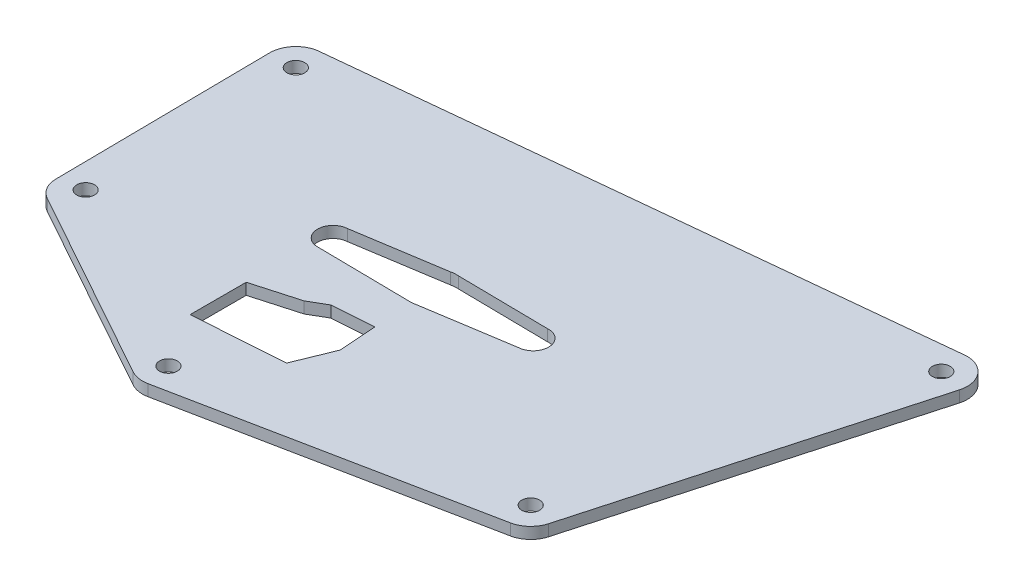
ISO-10303-21;
HEADER;
FILE_DESCRIPTION(('STEP AP214'),'2;1');
FILE_NAME('part.step','',(''),(''),'','','');
FILE_SCHEMA(('AUTOMOTIVE_DESIGN { 1 0 10303 214 1 1 1 1 }'));
ENDSEC;
DATA;
#1=APPLICATION_CONTEXT('core data for automotive mechanical design processes');
#2=APPLICATION_PROTOCOL_DEFINITION('international standard','automotive_design',2000,#1);
#3=PRODUCT_CONTEXT('',#1,'mechanical');
#4=PRODUCT('Part','Part','',(#3));
#5=PRODUCT_RELATED_PRODUCT_CATEGORY('part','',(#4));
#6=PRODUCT_DEFINITION_FORMATION('','',#4);
#7=PRODUCT_DEFINITION_CONTEXT('part definition',#1,'design');
#8=PRODUCT_DEFINITION('design','',#6,#7);
#9=PRODUCT_DEFINITION_SHAPE('','',#8);
#10=(LENGTH_UNIT() NAMED_UNIT(*) SI_UNIT(.MILLI.,.METRE.));
#11=(NAMED_UNIT(*) PLANE_ANGLE_UNIT() SI_UNIT($,.RADIAN.));
#12=(NAMED_UNIT(*) SI_UNIT($,.STERADIAN.) SOLID_ANGLE_UNIT());
#13=UNCERTAINTY_MEASURE_WITH_UNIT(LENGTH_MEASURE(1.E-05),#10,'distance_accuracy_value','');
#14=(GEOMETRIC_REPRESENTATION_CONTEXT(3) GLOBAL_UNCERTAINTY_ASSIGNED_CONTEXT((#13)) GLOBAL_UNIT_ASSIGNED_CONTEXT((#10,
#11,#12)) REPRESENTATION_CONTEXT('',''));
#15=CARTESIAN_POINT('',(0.,0.,0.));
#16=DIRECTION('',(0.,0.,1.));
#17=DIRECTION('',(1.,0.,0.));
#18=AXIS2_PLACEMENT_3D('',#15,#16,#17);
#19=CARTESIAN_POINT('',(-3.55000562107084,3.175,1.59698455984096));
#20=DIRECTION('',(0.,1.,0.));
#21=DIRECTION('',(0.,0.,1.));
#22=AXIS2_PLACEMENT_3D('',#19,#20,#21);
#23=PLANE('',#22);
#24=CARTESIAN_POINT('',(68.783132472174,3.175,-24.6864030686346));
#25=DIRECTION('',(0.,1.,0.));
#26=DIRECTION('',(0.,0.,1.));
#27=AXIS2_PLACEMENT_3D('',#24,#25,#26);
#28=CIRCLE('',#27,6.5405);
#29=CARTESIAN_POINT('',(69.4259490579315,3.175,-31.1952376100157));
#30=VERTEX_POINT('',#29);
#31=CARTESIAN_POINT('',(67.2249412442559,3.175,-31.0385822496117));
#32=VERTEX_POINT('',#31);
#33=EDGE_CURVE('E63',#30,#32,#28,.T.);
#34=ORIENTED_EDGE('',*,*,#33,.F.);
#35=DIRECTION('',(-0.999906246555034,0.,-0.0136929945674083));
#36=VECTOR('',#35,1.);
#37=CARTESIAN_POINT('',(69.4259490579315,3.175,-31.1952376100157));
#38=LINE('',#37,#36);
#39=CARTESIAN_POINT('',(94.5725620865182,3.175,-30.8508728890476));
#40=VERTEX_POINT('',#39);
#41=EDGE_CURVE('E237',#40,#30,#38,.T.);
#42=ORIENTED_EDGE('',*,*,#41,.F.);
#43=CARTESIAN_POINT('',(94.8791175551361,3.175,-26.5437685549665));
#44=DIRECTION('',(0.,1.,0.));
#45=DIRECTION('',(0.,0.,1.));
#46=AXIS2_PLACEMENT_3D('',#43,#44,#45);
#47=CIRCLE('',#46,4.318);
#48=CARTESIAN_POINT('',(95.185673023754,3.175,-22.2366642208853));
#49=VERTEX_POINT('',#48);
#50=EDGE_CURVE('E241',#49,#40,#47,.T.);
#51=ORIENTED_EDGE('',*,*,#50,.F.);
#52=DIRECTION('',(0.987887317154174,0.,-0.155172963514683));
#53=VECTOR('',#52,1.);
#54=CARTESIAN_POINT('',(70.3413237000924,3.175,-18.3342238876576));
#55=LINE('',#54,#53);
#56=CARTESIAN_POINT('',(70.3413237000924,3.175,-18.3342238876576));
#57=VERTEX_POINT('',#56);
#58=EDGE_CURVE('E280',#57,#49,#55,.T.);
#59=ORIENTED_EDGE('',*,*,#58,.F.);
#60=CARTESIAN_POINT('',(68.783132472174,3.175,-24.6864030686346));
#61=DIRECTION('',(0.,1.,0.));
#62=DIRECTION('',(0.,0.,1.));
#63=AXIS2_PLACEMENT_3D('',#60,#61,#62);
#64=CIRCLE('',#63,6.5405);
#65=CARTESIAN_POINT('',(68.1403158864175,3.175,-18.1775685272535));
#66=VERTEX_POINT('',#65);
#67=EDGE_CURVE('E276',#66,#57,#64,.T.);
#68=ORIENTED_EDGE('',*,*,#67,.F.);
#69=DIRECTION('',(0.999906246555034,0.,0.0136929945674115));
#70=VECTOR('',#69,1.);
#71=CARTESIAN_POINT('',(42.9937028578297,3.175,-18.5219332482216));
#72=LINE('',#71,#70);
#73=CARTESIAN_POINT('',(42.9937028578297,3.175,-18.5219332482216));
#74=VERTEX_POINT('',#73);
#75=EDGE_CURVE('E272',#74,#66,#72,.T.);
#76=ORIENTED_EDGE('',*,*,#75,.F.);
#77=CARTESIAN_POINT('',(42.6871473892118,3.175,-22.8290375823028));
#78=DIRECTION('',(0.,1.,0.));
#79=DIRECTION('',(0.,0.,1.));
#80=AXIS2_PLACEMENT_3D('',#77,#78,#79);
#81=CIRCLE('',#80,4.31800000000001);
#82=CARTESIAN_POINT('',(42.380591920594,3.175,-27.1361419163839));
#83=VERTEX_POINT('',#82);
#84=EDGE_CURVE('E268',#83,#74,#81,.T.);
#85=ORIENTED_EDGE('',*,*,#84,.F.);
#86=DIRECTION('',(-0.987887317154174,0.,0.155172963514684));
#87=VECTOR('',#86,1.);
#88=CARTESIAN_POINT('',(42.380591920594,3.175,-27.1361419163839));
#89=LINE('',#88,#87);
#90=EDGE_CURVE('E265',#32,#83,#89,.T.);
#91=ORIENTED_EDGE('',*,*,#90,.F.);
#92=EDGE_LOOP('',(#34,#42,#51,#59,#68,#76,#85,#91));
#93=FACE_BOUND('',#92,.T.);
#94=DIRECTION('',(0.,0.,1.));
#95=VECTOR('',#94,1.);
#96=CARTESIAN_POINT('',(41.2559345364309,3.175,0.));
#97=LINE('',#96,#95);
#98=CARTESIAN_POINT('',(41.2559345364309,3.175,0.));
#99=VERTEX_POINT('',#98);
#100=CARTESIAN_POINT('',(41.2559345364309,3.175,15.6784413285765));
#101=VERTEX_POINT('',#100);
#102=EDGE_CURVE('E290',#99,#101,#97,.T.);
#103=ORIENTED_EDGE('',*,*,#102,.F.);
#104=DIRECTION('',(-0.961898419475829,0.,0.27340707856583));
#105=VECTOR('',#104,1.);
#106=CARTESIAN_POINT('',(53.8620195794234,3.175,-3.58311523750619));
#107=LINE('',#106,#105);
#108=CARTESIAN_POINT('',(53.8620195794234,3.175,-3.58311523750619));
#109=VERTEX_POINT('',#108);
#110=EDGE_CURVE('E313',#109,#99,#107,.T.);
#111=ORIENTED_EDGE('',*,*,#110,.F.);
#112=DIRECTION('',(-0.864923842799596,0.,0.501903124274775));
#113=VECTOR('',#112,1.);
#114=CARTESIAN_POINT('',(58.5654688802979,3.175,-6.31246062280146));
#115=LINE('',#114,#113);
#116=CARTESIAN_POINT('',(58.5654688802979,3.175,-6.31246062280146));
#117=VERTEX_POINT('',#116);
#118=EDGE_CURVE('E356',#117,#109,#115,.T.);
#119=ORIENTED_EDGE('',*,*,#118,.F.);
#120=DIRECTION('',(-0.997476686910869,0.,0.0709947819865392));
#121=VECTOR('',#120,1.);
#122=CARTESIAN_POINT('',(70.0327952928143,3.175,-7.12864043863893));
#123=LINE('',#122,#121);
#124=CARTESIAN_POINT('',(70.0327952928143,3.175,-7.12864043863893));
#125=VERTEX_POINT('',#124);
#126=EDGE_CURVE('E352',#125,#117,#123,.T.);
#127=ORIENTED_EDGE('',*,*,#126,.F.);
#128=DIRECTION('',(-0.0709947819865391,0.,-0.997476686910869));
#129=VECTOR('',#128,1.);
#130=CARTESIAN_POINT('',(70.7748098328332,3.175,3.29666384862661));
#131=LINE('',#130,#129);
#132=CARTESIAN_POINT('',(70.7748098328332,3.175,3.29666384862661));
#133=VERTEX_POINT('',#132);
#134=EDGE_CURVE('E348',#133,#125,#131,.T.);
#135=ORIENTED_EDGE('',*,*,#134,.F.);
#136=DIRECTION('',(0.376798129201933,0.,-0.926295400954751));
#137=VECTOR('',#136,1.);
#138=CARTESIAN_POINT('',(66.4681046224158,3.175,13.8839808242359));
#139=LINE('',#138,#137);
#140=CARTESIAN_POINT('',(66.4681046224158,3.175,13.8839808242359));
#141=VERTEX_POINT('',#140);
#142=EDGE_CURVE('E344',#141,#133,#139,.T.);
#143=ORIENTED_EDGE('',*,*,#142,.F.);
#144=DIRECTION('',(0.997476686910869,0.,-0.0709947819865385));
#145=VECTOR('',#144,1.);
#146=CARTESIAN_POINT('',(41.2559345364309,3.175,15.6784413285765));
#147=LINE('',#146,#145);
#148=EDGE_CURVE('E340',#101,#141,#147,.T.);
#149=ORIENTED_EDGE('',*,*,#148,.F.);
#150=EDGE_LOOP('',(#103,#111,#119,#127,#135,#143,#149));
#151=FACE_BOUND('',#150,.T.);
#152=CARTESIAN_POINT('',(-3.71964814280204,3.175,-58.83082926478));
#153=DIRECTION('',(0.,1.,0.));
#154=DIRECTION('',(0.,0.,1.));
#155=AXIS2_PLACEMENT_3D('',#152,#153,#154);
#156=CIRCLE('',#155,2.4892);
#157=CARTESIAN_POINT('',(-3.71964814280204,3.175,-56.34162926478));
#158=VERTEX_POINT('',#157);
#159=EDGE_CURVE('E393',#158,#158,#156,.T.);
#160=ORIENTED_EDGE('',*,*,#159,.F.);
#161=EDGE_LOOP('',(#160));
#162=FACE_BOUND('',#161,.T.);
#163=CARTESIAN_POINT('',(50.6688213969302,3.175,31.1332223314106));
#164=DIRECTION('',(0.,1.,0.));
#165=DIRECTION('',(0.,0.,1.));
#166=AXIS2_PLACEMENT_3D('',#163,#164,#165);
#167=CIRCLE('',#166,2.4892);
#168=CARTESIAN_POINT('',(50.6688213969302,3.175,33.6224223314105));
#169=VERTEX_POINT('',#168);
#170=EDGE_CURVE('E409',#169,#169,#167,.T.);
#171=ORIENTED_EDGE('',*,*,#170,.F.);
#172=EDGE_LOOP('',(#171));
#173=FACE_BOUND('',#172,.T.);
#174=CARTESIAN_POINT('',(-3.55000562107084,3.175,1.59698455984096));
#175=DIRECTION('',(0.,1.,0.));
#176=DIRECTION('',(0.,0.,1.));
#177=AXIS2_PLACEMENT_3D('',#174,#175,#176);
#178=CIRCLE('',#177,6.73934713952884);
#179=CARTESIAN_POINT('',(-10.2889241238706,3.175,1.67299297844045));
#180=VERTEX_POINT('',#179);
#181=CARTESIAN_POINT('',(-6.82298680015305,3.175,7.48819785325084));
#182=VERTEX_POINT('',#181);
#183=EDGE_CURVE('E425',#180,#182,#178,.T.);
#184=ORIENTED_EDGE('',*,*,#183,.T.);
#185=DIRECTION('',(0.874151927692767,0.,0.485652558225547));
#186=VECTOR('',#185,1.);
#187=CARTESIAN_POINT('',(-6.82298680015305,3.175,7.48819785325084));
#188=LINE('',#187,#186);
#189=CARTESIAN_POINT('',(47.147014740446,3.175,37.4723098654602));
#190=VERTEX_POINT('',#189);
#191=EDGE_CURVE('E429',#182,#190,#188,.T.);
#192=ORIENTED_EDGE('',*,*,#191,.T.);
#193=CARTESIAN_POINT('',(50.6688213969302,3.175,31.1332223314106));
#194=DIRECTION('',(0.,1.,0.));
#195=DIRECTION('',(0.,0.,1.));
#196=AXIS2_PLACEMENT_3D('',#193,#194,#195);
#197=CIRCLE('',#196,7.2517);
#198=CARTESIAN_POINT('',(52.0976679162457,3.175,38.2427617338079));
#199=VERTEX_POINT('',#198);
#200=EDGE_CURVE('E433',#190,#199,#197,.T.);
#201=ORIENTED_EDGE('',*,*,#200,.T.);
#202=DIRECTION('',(0.980396238454062,0.,-0.197036076963399));
#203=VECTOR('',#202,1.);
#204=CARTESIAN_POINT('',(52.0976679162457,3.175,38.2427617338079));
#205=LINE('',#204,#203);
#206=CARTESIAN_POINT('',(136.359344262205,3.175,21.3081902877289));
#207=VERTEX_POINT('',#206);
#208=EDGE_CURVE('E436',#199,#207,#205,.T.);
#209=ORIENTED_EDGE('',*,*,#208,.T.);
#210=CARTESIAN_POINT('',(134.930497742889,3.175,14.1986508853315));
#211=DIRECTION('',(0.,1.,0.));
#212=DIRECTION('',(0.,0.,1.));
#213=AXIS2_PLACEMENT_3D('',#210,#211,#212);
#214=CIRCLE('',#213,7.25170000000002);
#215=CARTESIAN_POINT('',(141.916296900979,3.175,16.1443546173629));
#216=VERTEX_POINT('',#215);
#217=EDGE_CURVE('E439',#207,#216,#214,.T.);
#218=ORIENTED_EDGE('',*,*,#217,.T.);
#219=DIRECTION('',(0.268310014483694,0.,-0.96333261967389));
#220=VECTOR('',#219,1.);
#221=CARTESIAN_POINT('',(141.916296900979,3.175,16.1443546173629));
#222=LINE('',#221,#220);
#223=CARTESIAN_POINT('',(166.903433989707,3.175,-73.5687493685413));
#224=VERTEX_POINT('',#223);
#225=EDGE_CURVE('E442',#216,#224,#222,.T.);
#226=ORIENTED_EDGE('',*,*,#225,.T.);
#227=CARTESIAN_POINT('',(159.917634831618,3.175,-75.5144531005728));
#228=DIRECTION('',(0.,1.,0.));
#229=DIRECTION('',(0.,0.,1.));
#230=AXIS2_PLACEMENT_3D('',#227,#228,#229);
#231=CIRCLE('',#230,7.2517);
#232=CARTESIAN_POINT('',(159.182077211553,3.175,-82.728751949218));
#233=VERTEX_POINT('',#232);
#234=EDGE_CURVE('E445',#224,#233,#231,.T.);
#235=ORIENTED_EDGE('',*,*,#234,.T.);
#236=DIRECTION('',(-0.994842429864068,0.,0.101432439299058));
#237=VECTOR('',#236,1.);
#238=CARTESIAN_POINT('',(-4.36614572243492,3.175,-66.0536537655919));
#239=LINE('',#238,#237);
#240=CARTESIAN_POINT('',(-4.36614572243492,3.175,-66.0536537655919));
#241=VERTEX_POINT('',#240);
#242=EDGE_CURVE('E448',#233,#241,#239,.T.);
#243=ORIENTED_EDGE('',*,*,#242,.T.);
#244=CARTESIAN_POINT('',(-3.71964814280204,3.175,-58.83082926478));
#245=DIRECTION('',(0.,1.,0.));
#246=DIRECTION('',(0.,0.,1.));
#247=AXIS2_PLACEMENT_3D('',#244,#245,#246);
#248=CIRCLE('',#247,7.2517);
#249=CARTESIAN_POINT('',(-10.9695033076541,3.175,-58.6672658866423));
#250=VERTEX_POINT('',#249);
#251=EDGE_CURVE('E451',#241,#250,#248,.T.);
#252=ORIENTED_EDGE('',*,*,#251,.T.);
#253=DIRECTION('',(0.0112783058990494,0.,0.999936397885409));
#254=VECTOR('',#253,1.);
#255=CARTESIAN_POINT('',(-10.9695033076541,3.175,-58.6672658866423));
#256=LINE('',#255,#254);
#257=EDGE_CURVE('E454',#250,#180,#256,.T.);
#258=ORIENTED_EDGE('',*,*,#257,.T.);
#259=EDGE_LOOP('',(#184,#192,#201,#209,#218,#226,#235,#243,#252,#258));
#260=FACE_BOUND('',#259,.T.);
#261=CARTESIAN_POINT('',(159.917634831618,3.175,-75.5144531005728));
#262=DIRECTION('',(0.,1.,0.));
#263=DIRECTION('',(0.,0.,1.));
#264=AXIS2_PLACEMENT_3D('',#261,#262,#263);
#265=CIRCLE('',#264,2.48919999999963);
#266=CARTESIAN_POINT('',(159.917634831618,3.175,-73.0252531005731));
#267=VERTEX_POINT('',#266);
#268=EDGE_CURVE('E417',#267,#267,#265,.T.);
#269=ORIENTED_EDGE('',*,*,#268,.F.);
#270=EDGE_LOOP('',(#269));
#271=FACE_BOUND('',#270,.T.);
#272=CARTESIAN_POINT('',(134.930497742889,3.175,14.1986508853315));
#273=DIRECTION('',(0.,1.,0.));
#274=DIRECTION('',(0.,0.,1.));
#275=AXIS2_PLACEMENT_3D('',#272,#273,#274);
#276=CIRCLE('',#275,2.4892);
#277=CARTESIAN_POINT('',(134.930497742889,3.175,16.6878508853315));
#278=VERTEX_POINT('',#277);
#279=EDGE_CURVE('E401',#278,#278,#276,.T.);
#280=ORIENTED_EDGE('',*,*,#279,.F.);
#281=EDGE_LOOP('',(#280));
#282=FACE_BOUND('',#281,.T.);
#283=CARTESIAN_POINT('',(-3.50812631941597,3.175,0.0860171733952156));
#284=DIRECTION('',(0.,1.,0.));
#285=DIRECTION('',(0.,0.,1.));
#286=AXIS2_PLACEMENT_3D('',#283,#284,#285);
#287=CIRCLE('',#286,2.4892);
#288=CARTESIAN_POINT('',(-3.50812631941597,3.175,2.57521717339521));
#289=VERTEX_POINT('',#288);
#290=EDGE_CURVE('E385',#289,#289,#287,.T.);
#291=ORIENTED_EDGE('',*,*,#290,.F.);
#292=EDGE_LOOP('',(#291));
#293=FACE_BOUND('',#292,.T.);
#294=ADVANCED_FACE('F47',(#93,#151,#162,#173,#260,#271,#282,#293),#23,.T.);
#295=CARTESIAN_POINT('',(-3.55000562107084,0.,1.59698455984096));
#296=DIRECTION('',(0.,1.,0.));
#297=DIRECTION('',(0.,0.,1.));
#298=AXIS2_PLACEMENT_3D('',#295,#296,#297);
#299=PLANE('',#298);
#300=DIRECTION('',(-0.999906246555034,0.,-0.0136929945674083));
#301=VECTOR('',#300,1.);
#302=CARTESIAN_POINT('',(69.4259490579315,0.,-31.1952376100157));
#303=LINE('',#302,#301);
#304=CARTESIAN_POINT('',(94.5725620865182,0.,-30.8508728890476));
#305=VERTEX_POINT('',#304);
#306=CARTESIAN_POINT('',(69.4259490579315,0.,-31.1952376100157));
#307=VERTEX_POINT('',#306);
#308=EDGE_CURVE('E224',#305,#307,#303,.T.);
#309=ORIENTED_EDGE('',*,*,#308,.T.);
#310=CARTESIAN_POINT('',(68.783132472174,0.,-24.6864030686346));
#311=DIRECTION('',(0.,1.,0.));
#312=DIRECTION('',(0.,0.,1.));
#313=AXIS2_PLACEMENT_3D('',#310,#311,#312);
#314=CIRCLE('',#313,6.5405);
#315=CARTESIAN_POINT('',(67.2249412442559,0.,-31.0385822496117));
#316=VERTEX_POINT('',#315);
#317=EDGE_CURVE('E217',#307,#316,#314,.T.);
#318=ORIENTED_EDGE('',*,*,#317,.T.);
#319=DIRECTION('',(-0.987887317154174,0.,0.155172963514684));
#320=VECTOR('',#319,1.);
#321=CARTESIAN_POINT('',(42.380591920594,0.,-27.1361419163839));
#322=LINE('',#321,#320);
#323=CARTESIAN_POINT('',(42.380591920594,0.,-27.1361419163839));
#324=VERTEX_POINT('',#323);
#325=EDGE_CURVE('E227',#316,#324,#322,.T.);
#326=ORIENTED_EDGE('',*,*,#325,.T.);
#327=CARTESIAN_POINT('',(42.6871473892118,0.,-22.8290375823028));
#328=DIRECTION('',(0.,1.,0.));
#329=DIRECTION('',(0.,0.,1.));
#330=AXIS2_PLACEMENT_3D('',#327,#328,#329);
#331=CIRCLE('',#330,4.31800000000001);
#332=CARTESIAN_POINT('',(42.9937028578297,0.,-18.5219332482216));
#333=VERTEX_POINT('',#332);
#334=EDGE_CURVE('E71',#324,#333,#331,.T.);
#335=ORIENTED_EDGE('',*,*,#334,.T.);
#336=DIRECTION('',(0.999906246555034,0.,0.0136929945674115));
#337=VECTOR('',#336,1.);
#338=CARTESIAN_POINT('',(42.9937028578297,0.,-18.5219332482216));
#339=LINE('',#338,#337);
#340=CARTESIAN_POINT('',(68.1403158864175,0.,-18.1775685272535));
#341=VERTEX_POINT('',#340);
#342=EDGE_CURVE('E246',#333,#341,#339,.T.);
#343=ORIENTED_EDGE('',*,*,#342,.T.);
#344=CARTESIAN_POINT('',(68.783132472174,0.,-24.6864030686346));
#345=DIRECTION('',(0.,1.,0.));
#346=DIRECTION('',(0.,0.,1.));
#347=AXIS2_PLACEMENT_3D('',#344,#345,#346);
#348=CIRCLE('',#347,6.5405);
#349=CARTESIAN_POINT('',(70.3413237000924,0.,-18.3342238876576));
#350=VERTEX_POINT('',#349);
#351=EDGE_CURVE('E250',#341,#350,#348,.T.);
#352=ORIENTED_EDGE('',*,*,#351,.T.);
#353=DIRECTION('',(0.987887317154174,0.,-0.155172963514683));
#354=VECTOR('',#353,1.);
#355=CARTESIAN_POINT('',(70.3413237000924,0.,-18.3342238876576));
#356=LINE('',#355,#354);
#357=CARTESIAN_POINT('',(95.185673023754,0.,-22.2366642208853));
#358=VERTEX_POINT('',#357);
#359=EDGE_CURVE('E254',#350,#358,#356,.T.);
#360=ORIENTED_EDGE('',*,*,#359,.T.);
#361=CARTESIAN_POINT('',(94.8791175551361,0.,-26.5437685549665));
#362=DIRECTION('',(0.,1.,0.));
#363=DIRECTION('',(0.,0.,1.));
#364=AXIS2_PLACEMENT_3D('',#361,#362,#363);
#365=CIRCLE('',#364,4.318);
#366=EDGE_CURVE('E258',#358,#305,#365,.T.);
#367=ORIENTED_EDGE('',*,*,#366,.T.);
#368=EDGE_LOOP('',(#309,#318,#326,#335,#343,#352,#360,#367));
#369=FACE_BOUND('',#368,.T.);
#370=DIRECTION('',(-0.961898419475829,0.,0.27340707856583));
#371=VECTOR('',#370,1.);
#372=CARTESIAN_POINT('',(53.8620195794234,0.,-3.58311523750619));
#373=LINE('',#372,#371);
#374=CARTESIAN_POINT('',(53.8620195794234,0.,-3.58311523750619));
#375=VERTEX_POINT('',#374);
#376=CARTESIAN_POINT('',(41.2559345364309,0.,0.));
#377=VERTEX_POINT('',#376);
#378=EDGE_CURVE('E333',#375,#377,#373,.T.);
#379=ORIENTED_EDGE('',*,*,#378,.T.);
#380=DIRECTION('',(0.,0.,1.));
#381=VECTOR('',#380,1.);
#382=CARTESIAN_POINT('',(41.2559345364309,0.,0.));
#383=LINE('',#382,#381);
#384=CARTESIAN_POINT('',(41.2559345364309,0.,15.6784413285765));
#385=VERTEX_POINT('',#384);
#386=EDGE_CURVE('E308',#377,#385,#383,.T.);
#387=ORIENTED_EDGE('',*,*,#386,.T.);
#388=DIRECTION('',(0.997476686910869,0.,-0.0709947819865385));
#389=VECTOR('',#388,1.);
#390=CARTESIAN_POINT('',(41.2559345364309,0.,15.6784413285765));
#391=LINE('',#390,#389);
#392=CARTESIAN_POINT('',(66.4681046224158,0.,13.8839808242359));
#393=VERTEX_POINT('',#392);
#394=EDGE_CURVE('E312',#385,#393,#391,.T.);
#395=ORIENTED_EDGE('',*,*,#394,.T.);
#396=DIRECTION('',(0.376798129201933,0.,-0.926295400954751));
#397=VECTOR('',#396,1.);
#398=CARTESIAN_POINT('',(66.4681046224158,0.,13.8839808242359));
#399=LINE('',#398,#397);
#400=CARTESIAN_POINT('',(70.7748098328332,0.,3.29666384862661));
#401=VERTEX_POINT('',#400);
#402=EDGE_CURVE('E317',#393,#401,#399,.T.);
#403=ORIENTED_EDGE('',*,*,#402,.T.);
#404=DIRECTION('',(-0.0709947819865391,0.,-0.997476686910869));
#405=VECTOR('',#404,1.);
#406=CARTESIAN_POINT('',(70.7748098328332,0.,3.29666384862661));
#407=LINE('',#406,#405);
#408=CARTESIAN_POINT('',(70.0327952928143,0.,-7.12864043863893));
#409=VERTEX_POINT('',#408);
#410=EDGE_CURVE('E321',#401,#409,#407,.T.);
#411=ORIENTED_EDGE('',*,*,#410,.T.);
#412=DIRECTION('',(-0.997476686910869,0.,0.0709947819865392));
#413=VECTOR('',#412,1.);
#414=CARTESIAN_POINT('',(70.0327952928143,0.,-7.12864043863893));
#415=LINE('',#414,#413);
#416=CARTESIAN_POINT('',(58.5654688802979,0.,-6.31246062280146));
#417=VERTEX_POINT('',#416);
#418=EDGE_CURVE('E325',#409,#417,#415,.T.);
#419=ORIENTED_EDGE('',*,*,#418,.T.);
#420=DIRECTION('',(-0.864923842799596,0.,0.501903124274775));
#421=VECTOR('',#420,1.);
#422=CARTESIAN_POINT('',(58.5654688802979,0.,-6.31246062280146));
#423=LINE('',#422,#421);
#424=EDGE_CURVE('E329',#417,#375,#423,.T.);
#425=ORIENTED_EDGE('',*,*,#424,.T.);
#426=EDGE_LOOP('',(#379,#387,#395,#403,#411,#419,#425));
#427=FACE_BOUND('',#426,.T.);
#428=CARTESIAN_POINT('',(-3.55000562107084,0.,1.59698455984096));
#429=DIRECTION('',(0.,1.,0.));
#430=DIRECTION('',(0.,0.,1.));
#431=AXIS2_PLACEMENT_3D('',#428,#429,#430);
#432=CIRCLE('',#431,6.73934713952884);
#433=CARTESIAN_POINT('',(-10.2889241238706,0.,1.67299297844045));
#434=VERTEX_POINT('',#433);
#435=CARTESIAN_POINT('',(-6.82298680015305,0.,7.48819785325084));
#436=VERTEX_POINT('',#435);
#437=EDGE_CURVE('E421',#434,#436,#432,.T.);
#438=ORIENTED_EDGE('',*,*,#437,.F.);
#439=DIRECTION('',(0.0112783058990494,0.,0.999936397885409));
#440=VECTOR('',#439,1.);
#441=CARTESIAN_POINT('',(-10.9695033076541,0.,-58.6672658866423));
#442=LINE('',#441,#440);
#443=CARTESIAN_POINT('',(-10.9695033076541,0.,-58.6672658866423));
#444=VERTEX_POINT('',#443);
#445=EDGE_CURVE('E430',#444,#434,#442,.T.);
#446=ORIENTED_EDGE('',*,*,#445,.F.);
#447=CARTESIAN_POINT('',(-3.71964814280204,0.,-58.83082926478));
#448=DIRECTION('',(0.,1.,0.));
#449=DIRECTION('',(0.,0.,1.));
#450=AXIS2_PLACEMENT_3D('',#447,#448,#449);
#451=CIRCLE('',#450,7.2517);
#452=CARTESIAN_POINT('',(-4.36614572243492,0.,-66.0536537655919));
#453=VERTEX_POINT('',#452);
#454=EDGE_CURVE('E482',#453,#444,#451,.T.);
#455=ORIENTED_EDGE('',*,*,#454,.F.);
#456=DIRECTION('',(-0.994842429864068,0.,0.101432439299058));
#457=VECTOR('',#456,1.);
#458=CARTESIAN_POINT('',(-4.36614572243492,0.,-66.0536537655919));
#459=LINE('',#458,#457);
#460=CARTESIAN_POINT('',(159.182077211553,0.,-82.728751949218));
#461=VERTEX_POINT('',#460);
#462=EDGE_CURVE('E479',#461,#453,#459,.T.);
#463=ORIENTED_EDGE('',*,*,#462,.F.);
#464=CARTESIAN_POINT('',(159.917634831618,0.,-75.5144531005728));
#465=DIRECTION('',(0.,1.,0.));
#466=DIRECTION('',(0.,0.,1.));
#467=AXIS2_PLACEMENT_3D('',#464,#465,#466);
#468=CIRCLE('',#467,7.2517);
#469=CARTESIAN_POINT('',(166.903433989707,0.,-73.5687493685413));
#470=VERTEX_POINT('',#469);
#471=EDGE_CURVE('E476',#470,#461,#468,.T.);
#472=ORIENTED_EDGE('',*,*,#471,.F.);
#473=DIRECTION('',(0.268310014483694,0.,-0.96333261967389));
#474=VECTOR('',#473,1.);
#475=CARTESIAN_POINT('',(141.916296900979,0.,16.1443546173629));
#476=LINE('',#475,#474);
#477=CARTESIAN_POINT('',(141.916296900979,0.,16.1443546173629));
#478=VERTEX_POINT('',#477);
#479=EDGE_CURVE('E473',#478,#470,#476,.T.);
#480=ORIENTED_EDGE('',*,*,#479,.F.);
#481=CARTESIAN_POINT('',(134.930497742889,0.,14.1986508853315));
#482=DIRECTION('',(0.,1.,0.));
#483=DIRECTION('',(0.,0.,1.));
#484=AXIS2_PLACEMENT_3D('',#481,#482,#483);
#485=CIRCLE('',#484,7.25170000000002);
#486=CARTESIAN_POINT('',(136.359344262205,0.,21.3081902877289));
#487=VERTEX_POINT('',#486);
#488=EDGE_CURVE('E470',#487,#478,#485,.T.);
#489=ORIENTED_EDGE('',*,*,#488,.F.);
#490=DIRECTION('',(0.980396238454062,0.,-0.197036076963399));
#491=VECTOR('',#490,1.);
#492=CARTESIAN_POINT('',(52.0976679162457,0.,38.2427617338079));
#493=LINE('',#492,#491);
#494=CARTESIAN_POINT('',(52.0976679162457,0.,38.2427617338079));
#495=VERTEX_POINT('',#494);
#496=EDGE_CURVE('E467',#495,#487,#493,.T.);
#497=ORIENTED_EDGE('',*,*,#496,.F.);
#498=CARTESIAN_POINT('',(50.6688213969302,0.,31.1332223314106));
#499=DIRECTION('',(0.,1.,0.));
#500=DIRECTION('',(0.,0.,1.));
#501=AXIS2_PLACEMENT_3D('',#498,#499,#500);
#502=CIRCLE('',#501,7.2517);
#503=CARTESIAN_POINT('',(47.147014740446,0.,37.4723098654602));
#504=VERTEX_POINT('',#503);
#505=EDGE_CURVE('E464',#504,#495,#502,.T.);
#506=ORIENTED_EDGE('',*,*,#505,.F.);
#507=DIRECTION('',(0.874151927692767,0.,0.485652558225547));
#508=VECTOR('',#507,1.);
#509=CARTESIAN_POINT('',(-6.82298680015305,0.,7.48819785325084));
#510=LINE('',#509,#508);
#511=EDGE_CURVE('E461',#436,#504,#510,.T.);
#512=ORIENTED_EDGE('',*,*,#511,.F.);
#513=EDGE_LOOP('',(#438,#446,#455,#463,#472,#480,#489,#497,#506,#512));
#514=FACE_BOUND('',#513,.T.);
#515=CARTESIAN_POINT('',(159.917634831618,0.,-75.5144531005728));
#516=DIRECTION('',(0.,1.,0.));
#517=DIRECTION('',(0.,0.,1.));
#518=AXIS2_PLACEMENT_3D('',#515,#516,#517);
#519=CIRCLE('',#518,2.48919999999963);
#520=CARTESIAN_POINT('',(159.917634831618,0.,-73.0252531005731));
#521=VERTEX_POINT('',#520);
#522=EDGE_CURVE('E413',#521,#521,#519,.T.);
#523=ORIENTED_EDGE('',*,*,#522,.T.);
#524=EDGE_LOOP('',(#523));
#525=FACE_BOUND('',#524,.T.);
#526=CARTESIAN_POINT('',(50.6688213969302,0.,31.1332223314106));
#527=DIRECTION('',(0.,1.,0.));
#528=DIRECTION('',(0.,0.,1.));
#529=AXIS2_PLACEMENT_3D('',#526,#527,#528);
#530=CIRCLE('',#529,2.4892);
#531=CARTESIAN_POINT('',(50.6688213969302,0.,33.6224223314105));
#532=VERTEX_POINT('',#531);
#533=EDGE_CURVE('E405',#532,#532,#530,.T.);
#534=ORIENTED_EDGE('',*,*,#533,.T.);
#535=EDGE_LOOP('',(#534));
#536=FACE_BOUND('',#535,.T.);
#537=CARTESIAN_POINT('',(134.930497742889,0.,14.1986508853315));
#538=DIRECTION('',(0.,1.,0.));
#539=DIRECTION('',(0.,0.,1.));
#540=AXIS2_PLACEMENT_3D('',#537,#538,#539);
#541=CIRCLE('',#540,2.4892);
#542=CARTESIAN_POINT('',(134.930497742889,0.,16.6878508853315));
#543=VERTEX_POINT('',#542);
#544=EDGE_CURVE('E397',#543,#543,#541,.T.);
#545=ORIENTED_EDGE('',*,*,#544,.T.);
#546=EDGE_LOOP('',(#545));
#547=FACE_BOUND('',#546,.T.);
#548=CARTESIAN_POINT('',(-3.71964814280204,0.,-58.83082926478));
#549=DIRECTION('',(0.,1.,0.));
#550=DIRECTION('',(0.,0.,1.));
#551=AXIS2_PLACEMENT_3D('',#548,#549,#550);
#552=CIRCLE('',#551,2.4892);
#553=CARTESIAN_POINT('',(-3.71964814280204,0.,-56.34162926478));
#554=VERTEX_POINT('',#553);
#555=EDGE_CURVE('E389',#554,#554,#552,.T.);
#556=ORIENTED_EDGE('',*,*,#555,.T.);
#557=EDGE_LOOP('',(#556));
#558=FACE_BOUND('',#557,.T.);
#559=CARTESIAN_POINT('',(-3.50812631941597,0.,0.0860171733952156));
#560=DIRECTION('',(0.,1.,0.));
#561=DIRECTION('',(0.,0.,1.));
#562=AXIS2_PLACEMENT_3D('',#559,#560,#561);
#563=CIRCLE('',#562,2.4892);
#564=CARTESIAN_POINT('',(-3.50812631941597,0.,2.57521717339521));
#565=VERTEX_POINT('',#564);
#566=EDGE_CURVE('E366',#565,#565,#563,.T.);
#567=ORIENTED_EDGE('',*,*,#566,.T.);
#568=EDGE_LOOP('',(#567));
#569=FACE_BOUND('',#568,.T.);
#570=ADVANCED_FACE('F232',(#369,#427,#514,#525,#536,#547,#558,#569),#299,.F.);
#571=CARTESIAN_POINT('',(-3.55000562107084,3.175,1.59698455984096));
#572=DIRECTION('',(0.,-1.,0.));
#573=DIRECTION('',(0.,0.,-1.));
#574=AXIS2_PLACEMENT_3D('',#571,#572,#573);
#575=CYLINDRICAL_SURFACE('',#574,6.73934713952884);
#576=ORIENTED_EDGE('',*,*,#437,.T.);
#577=DIRECTION('',(0.,-1.,0.));
#578=VECTOR('',#577,1.);
#579=CARTESIAN_POINT('',(-6.82298680015305,3.175,7.48819785325084));
#580=LINE('',#579,#578);
#581=EDGE_CURVE('E11',#182,#436,#580,.T.);
#582=ORIENTED_EDGE('',*,*,#581,.F.);
#583=ORIENTED_EDGE('',*,*,#183,.F.);
#584=DIRECTION('',(0.,-1.,0.));
#585=VECTOR('',#584,1.);
#586=CARTESIAN_POINT('',(-10.2889241238706,3.175,1.67299297844045));
#587=LINE('',#586,#585);
#588=EDGE_CURVE('E457',#180,#434,#587,.T.);
#589=ORIENTED_EDGE('',*,*,#588,.T.);
#590=EDGE_LOOP('',(#576,#582,#583,#589));
#591=FACE_BOUND('',#590,.T.);
#592=ADVANCED_FACE('F49',(#591),#575,.T.);
#593=CARTESIAN_POINT('',(-6.82298680015305,3.175,7.48819785325084));
#594=DIRECTION('',(0.485652558225547,0.,-0.874151927692767));
#595=DIRECTION('',(-0.874151927692768,0.,-0.485652558225547));
#596=AXIS2_PLACEMENT_3D('',#593,#594,#595);
#597=PLANE('',#596);
#598=ORIENTED_EDGE('',*,*,#511,.T.);
#599=DIRECTION('',(0.,-1.,0.));
#600=VECTOR('',#599,1.);
#601=CARTESIAN_POINT('',(47.147014740446,3.175,37.4723098654602));
#602=LINE('',#601,#600);
#603=EDGE_CURVE('E56',#190,#504,#602,.T.);
#604=ORIENTED_EDGE('',*,*,#603,.F.);
#605=ORIENTED_EDGE('',*,*,#191,.F.);
#606=ORIENTED_EDGE('',*,*,#581,.T.);
#607=EDGE_LOOP('',(#598,#604,#605,#606));
#608=FACE_BOUND('',#607,.T.);
#609=ADVANCED_FACE('F546',(#608),#597,.F.);
#610=CARTESIAN_POINT('',(50.6688213969302,3.175,31.1332223314106));
#611=DIRECTION('',(0.,-1.,0.));
#612=DIRECTION('',(0.,0.,-1.));
#613=AXIS2_PLACEMENT_3D('',#610,#611,#612);
#614=CYLINDRICAL_SURFACE('',#613,7.2517);
#615=ORIENTED_EDGE('',*,*,#505,.T.);
#616=DIRECTION('',(0.,-1.,0.));
#617=VECTOR('',#616,1.);
#618=CARTESIAN_POINT('',(52.0976679162457,3.175,38.2427617338079));
#619=LINE('',#618,#617);
#620=EDGE_CURVE('E514',#199,#495,#619,.T.);
#621=ORIENTED_EDGE('',*,*,#620,.F.);
#622=ORIENTED_EDGE('',*,*,#200,.F.);
#623=ORIENTED_EDGE('',*,*,#603,.T.);
#624=EDGE_LOOP('',(#615,#621,#622,#623));
#625=FACE_BOUND('',#624,.T.);
#626=ADVANCED_FACE('F523',(#625),#614,.T.);
#627=CARTESIAN_POINT('',(52.0976679162457,3.175,38.2427617338079));
#628=DIRECTION('',(-0.197036076963399,0.,-0.980396238454062));
#629=DIRECTION('',(-0.980396238454062,0.,0.197036076963399));
#630=AXIS2_PLACEMENT_3D('',#627,#628,#629);
#631=PLANE('',#630);
#632=ORIENTED_EDGE('',*,*,#496,.T.);
#633=DIRECTION('',(0.,-1.,0.));
#634=VECTOR('',#633,1.);
#635=CARTESIAN_POINT('',(136.359344262205,3.175,21.3081902877289));
#636=LINE('',#635,#634);
#637=EDGE_CURVE('E510',#207,#487,#636,.T.);
#638=ORIENTED_EDGE('',*,*,#637,.F.);
#639=ORIENTED_EDGE('',*,*,#208,.F.);
#640=ORIENTED_EDGE('',*,*,#620,.T.);
#641=EDGE_LOOP('',(#632,#638,#639,#640));
#642=FACE_BOUND('',#641,.T.);
#643=ADVANCED_FACE('F534',(#642),#631,.F.);
#644=CARTESIAN_POINT('',(134.930497742889,3.175,14.1986508853315));
#645=DIRECTION('',(0.,-1.,0.));
#646=DIRECTION('',(0.,0.,-1.));
#647=AXIS2_PLACEMENT_3D('',#644,#645,#646);
#648=CYLINDRICAL_SURFACE('',#647,7.25170000000002);
#649=ORIENTED_EDGE('',*,*,#488,.T.);
#650=DIRECTION('',(0.,-1.,0.));
#651=VECTOR('',#650,1.);
#652=CARTESIAN_POINT('',(141.916296900979,3.175,16.1443546173629));
#653=LINE('',#652,#651);
#654=EDGE_CURVE('E506',#216,#478,#653,.T.);
#655=ORIENTED_EDGE('',*,*,#654,.F.);
#656=ORIENTED_EDGE('',*,*,#217,.F.);
#657=ORIENTED_EDGE('',*,*,#637,.T.);
#658=EDGE_LOOP('',(#649,#655,#656,#657));
#659=FACE_BOUND('',#658,.T.);
#660=ADVANCED_FACE('F538',(#659),#648,.T.);
#661=CARTESIAN_POINT('',(141.916296900979,3.175,16.1443546173629));
#662=DIRECTION('',(-0.96333261967389,0.,-0.268310014483694));
#663=DIRECTION('',(-0.268310014483695,0.,0.96333261967389));
#664=AXIS2_PLACEMENT_3D('',#661,#662,#663);
#665=PLANE('',#664);
#666=ORIENTED_EDGE('',*,*,#479,.T.);
#667=DIRECTION('',(0.,-1.,0.));
#668=VECTOR('',#667,1.);
#669=CARTESIAN_POINT('',(166.903433989707,3.175,-73.5687493685413));
#670=LINE('',#669,#668);
#671=EDGE_CURVE('E502',#224,#470,#670,.T.);
#672=ORIENTED_EDGE('',*,*,#671,.F.);
#673=ORIENTED_EDGE('',*,*,#225,.F.);
#674=ORIENTED_EDGE('',*,*,#654,.T.);
#675=EDGE_LOOP('',(#666,#672,#673,#674));
#676=FACE_BOUND('',#675,.T.);
#677=ADVANCED_FACE('F569',(#676),#665,.F.);
#678=CARTESIAN_POINT('',(159.917634831618,3.175,-75.5144531005728));
#679=DIRECTION('',(0.,-1.,0.));
#680=DIRECTION('',(0.,0.,-1.));
#681=AXIS2_PLACEMENT_3D('',#678,#679,#680);
#682=CYLINDRICAL_SURFACE('',#681,7.2517);
#683=ORIENTED_EDGE('',*,*,#471,.T.);
#684=DIRECTION('',(0.,-1.,0.));
#685=VECTOR('',#684,1.);
#686=CARTESIAN_POINT('',(159.182077211553,3.175,-82.728751949218));
#687=LINE('',#686,#685);
#688=EDGE_CURVE('E498',#233,#461,#687,.T.);
#689=ORIENTED_EDGE('',*,*,#688,.F.);
#690=ORIENTED_EDGE('',*,*,#234,.F.);
#691=ORIENTED_EDGE('',*,*,#671,.T.);
#692=EDGE_LOOP('',(#683,#689,#690,#691));
#693=FACE_BOUND('',#692,.T.);
#694=ADVANCED_FACE('F566',(#693),#682,.T.);
#695=CARTESIAN_POINT('',(-4.36614572243492,3.175,-66.0536537655919));
#696=DIRECTION('',(0.101432439299058,0.,0.994842429864068));
#697=DIRECTION('',(0.994842429864068,0.,-0.101432439299058));
#698=AXIS2_PLACEMENT_3D('',#695,#696,#697);
#699=PLANE('',#698);
#700=ORIENTED_EDGE('',*,*,#462,.T.);
#701=DIRECTION('',(0.,-1.,0.));
#702=VECTOR('',#701,1.);
#703=CARTESIAN_POINT('',(-4.36614572243492,3.175,-66.0536537655919));
#704=LINE('',#703,#702);
#705=EDGE_CURVE('E494',#241,#453,#704,.T.);
#706=ORIENTED_EDGE('',*,*,#705,.F.);
#707=ORIENTED_EDGE('',*,*,#242,.F.);
#708=ORIENTED_EDGE('',*,*,#688,.T.);
#709=EDGE_LOOP('',(#700,#706,#707,#708));
#710=FACE_BOUND('',#709,.T.);
#711=ADVANCED_FACE('F562',(#710),#699,.F.);
#712=CARTESIAN_POINT('',(-3.71964814280204,3.175,-58.83082926478));
#713=DIRECTION('',(0.,-1.,0.));
#714=DIRECTION('',(0.,0.,-1.));
#715=AXIS2_PLACEMENT_3D('',#712,#713,#714);
#716=CYLINDRICAL_SURFACE('',#715,7.2517);
#717=ORIENTED_EDGE('',*,*,#454,.T.);
#718=DIRECTION('',(0.,-1.,0.));
#719=VECTOR('',#718,1.);
#720=CARTESIAN_POINT('',(-10.9695033076541,3.175,-58.6672658866423));
#721=LINE('',#720,#719);
#722=EDGE_CURVE('E490',#250,#444,#721,.T.);
#723=ORIENTED_EDGE('',*,*,#722,.F.);
#724=ORIENTED_EDGE('',*,*,#251,.F.);
#725=ORIENTED_EDGE('',*,*,#705,.T.);
#726=EDGE_LOOP('',(#717,#723,#724,#725));
#727=FACE_BOUND('',#726,.T.);
#728=ADVANCED_FACE('F558',(#727),#716,.T.);
#729=CARTESIAN_POINT('',(-10.9695033076541,3.175,-58.6672658866423));
#730=DIRECTION('',(0.999936397885409,0.,-0.0112783058990494));
#731=DIRECTION('',(-0.0112783058990494,0.,-0.999936397885409));
#732=AXIS2_PLACEMENT_3D('',#729,#730,#731);
#733=PLANE('',#732);
#734=ORIENTED_EDGE('',*,*,#445,.T.);
#735=ORIENTED_EDGE('',*,*,#588,.F.);
#736=ORIENTED_EDGE('',*,*,#257,.F.);
#737=ORIENTED_EDGE('',*,*,#722,.T.);
#738=EDGE_LOOP('',(#734,#735,#736,#737));
#739=FACE_BOUND('',#738,.T.);
#740=ADVANCED_FACE('F553',(#739),#733,.F.);
#741=CARTESIAN_POINT('',(159.917634831618,3.175,-75.5144531005728));
#742=DIRECTION('',(0.,-1.,0.));
#743=DIRECTION('',(0.,0.,-1.));
#744=AXIS2_PLACEMENT_3D('',#741,#742,#743);
#745=CYLINDRICAL_SURFACE('',#744,2.48919999999963);
#746=ORIENTED_EDGE('',*,*,#268,.T.);
#747=EDGE_LOOP('',(#746));
#748=FACE_BOUND('',#747,.T.);
#749=ORIENTED_EDGE('',*,*,#522,.F.);
#750=EDGE_LOOP('',(#749));
#751=FACE_BOUND('',#750,.T.);
#752=ADVANCED_FACE('F588',(#748,#751),#745,.F.);
#753=CARTESIAN_POINT('',(50.6688213969302,3.175,31.1332223314106));
#754=DIRECTION('',(0.,-1.,0.));
#755=DIRECTION('',(0.,0.,-1.));
#756=AXIS2_PLACEMENT_3D('',#753,#754,#755);
#757=CYLINDRICAL_SURFACE('',#756,2.4892);
#758=ORIENTED_EDGE('',*,*,#170,.T.);
#759=EDGE_LOOP('',(#758));
#760=FACE_BOUND('',#759,.T.);
#761=ORIENTED_EDGE('',*,*,#533,.F.);
#762=EDGE_LOOP('',(#761));
#763=FACE_BOUND('',#762,.T.);
#764=ADVANCED_FACE('F617',(#760,#763),#757,.F.);
#765=CARTESIAN_POINT('',(134.930497742889,3.175,14.1986508853315));
#766=DIRECTION('',(0.,-1.,0.));
#767=DIRECTION('',(0.,0.,-1.));
#768=AXIS2_PLACEMENT_3D('',#765,#766,#767);
#769=CYLINDRICAL_SURFACE('',#768,2.4892);
#770=ORIENTED_EDGE('',*,*,#279,.T.);
#771=EDGE_LOOP('',(#770));
#772=FACE_BOUND('',#771,.T.);
#773=ORIENTED_EDGE('',*,*,#544,.F.);
#774=EDGE_LOOP('',(#773));
#775=FACE_BOUND('',#774,.T.);
#776=ADVANCED_FACE('F625',(#772,#775),#769,.F.);
#777=CARTESIAN_POINT('',(-3.71964814280204,3.175,-58.83082926478));
#778=DIRECTION('',(0.,-1.,0.));
#779=DIRECTION('',(0.,0.,-1.));
#780=AXIS2_PLACEMENT_3D('',#777,#778,#779);
#781=CYLINDRICAL_SURFACE('',#780,2.4892);
#782=ORIENTED_EDGE('',*,*,#159,.T.);
#783=EDGE_LOOP('',(#782));
#784=FACE_BOUND('',#783,.T.);
#785=ORIENTED_EDGE('',*,*,#555,.F.);
#786=EDGE_LOOP('',(#785));
#787=FACE_BOUND('',#786,.T.);
#788=ADVANCED_FACE('F633',(#784,#787),#781,.F.);
#789=CARTESIAN_POINT('',(-3.50812631941597,3.175,0.0860171733952156));
#790=DIRECTION('',(0.,-1.,0.));
#791=DIRECTION('',(0.,0.,-1.));
#792=AXIS2_PLACEMENT_3D('',#789,#790,#791);
#793=CYLINDRICAL_SURFACE('',#792,2.4892);
#794=ORIENTED_EDGE('',*,*,#290,.T.);
#795=EDGE_LOOP('',(#794));
#796=FACE_BOUND('',#795,.T.);
#797=ORIENTED_EDGE('',*,*,#566,.F.);
#798=EDGE_LOOP('',(#797));
#799=FACE_BOUND('',#798,.T.);
#800=ADVANCED_FACE('F642',(#796,#799),#793,.F.);
#801=CARTESIAN_POINT('',(41.2559345364309,0.,0.));
#802=DIRECTION('',(-1.,0.,0.));
#803=DIRECTION('',(0.,0.,1.));
#804=AXIS2_PLACEMENT_3D('',#801,#802,#803);
#805=PLANE('',#804);
#806=ORIENTED_EDGE('',*,*,#102,.T.);
#807=DIRECTION('',(0.,1.,0.));
#808=VECTOR('',#807,1.);
#809=CARTESIAN_POINT('',(41.2559345364309,0.,15.6784413285765));
#810=LINE('',#809,#808);
#811=EDGE_CURVE('E337',#385,#101,#810,.T.);
#812=ORIENTED_EDGE('',*,*,#811,.F.);
#813=ORIENTED_EDGE('',*,*,#386,.F.);
#814=DIRECTION('',(0.,1.,0.));
#815=VECTOR('',#814,1.);
#816=CARTESIAN_POINT('',(41.2559345364309,0.,0.));
#817=LINE('',#816,#815);
#818=EDGE_CURVE('E363',#377,#99,#817,.T.);
#819=ORIENTED_EDGE('',*,*,#818,.T.);
#820=EDGE_LOOP('',(#806,#812,#813,#819));
#821=FACE_BOUND('',#820,.T.);
#822=ADVANCED_FACE('F651',(#821),#805,.F.);
#823=CARTESIAN_POINT('',(53.8620195794234,0.,-3.58311523750619));
#824=DIRECTION('',(-0.27340707856583,0.,-0.961898419475829));
#825=DIRECTION('',(-0.961898419475829,0.,0.27340707856583));
#826=AXIS2_PLACEMENT_3D('',#823,#824,#825);
#827=PLANE('',#826);
#828=ORIENTED_EDGE('',*,*,#110,.T.);
#829=ORIENTED_EDGE('',*,*,#818,.F.);
#830=ORIENTED_EDGE('',*,*,#378,.F.);
#831=DIRECTION('',(0.,1.,0.));
#832=VECTOR('',#831,1.);
#833=CARTESIAN_POINT('',(53.8620195794234,0.,-3.58311523750619));
#834=LINE('',#833,#832);
#835=EDGE_CURVE('E367',#375,#109,#834,.T.);
#836=ORIENTED_EDGE('',*,*,#835,.T.);
#837=EDGE_LOOP('',(#828,#829,#830,#836));
#838=FACE_BOUND('',#837,.T.);
#839=ADVANCED_FACE('F660',(#838),#827,.F.);
#840=CARTESIAN_POINT('',(58.5654688802979,0.,-6.31246062280146));
#841=DIRECTION('',(-0.501903124274775,0.,-0.864923842799596));
#842=DIRECTION('',(-0.864923842799596,0.,0.501903124274775));
#843=AXIS2_PLACEMENT_3D('',#840,#841,#842);
#844=PLANE('',#843);
#845=ORIENTED_EDGE('',*,*,#118,.T.);
#846=ORIENTED_EDGE('',*,*,#835,.F.);
#847=ORIENTED_EDGE('',*,*,#424,.F.);
#848=DIRECTION('',(0.,1.,0.));
#849=VECTOR('',#848,1.);
#850=CARTESIAN_POINT('',(58.5654688802979,0.,-6.31246062280146));
#851=LINE('',#850,#849);
#852=EDGE_CURVE('E370',#417,#117,#851,.T.);
#853=ORIENTED_EDGE('',*,*,#852,.T.);
#854=EDGE_LOOP('',(#845,#846,#847,#853));
#855=FACE_BOUND('',#854,.T.);
#856=ADVANCED_FACE('F669',(#855),#844,.F.);
#857=CARTESIAN_POINT('',(70.0327952928143,0.,-7.12864043863893));
#858=DIRECTION('',(-0.0709947819865392,0.,-0.997476686910869));
#859=DIRECTION('',(-0.997476686910869,0.,0.0709947819865392));
#860=AXIS2_PLACEMENT_3D('',#857,#858,#859);
#861=PLANE('',#860);
#862=ORIENTED_EDGE('',*,*,#126,.T.);
#863=ORIENTED_EDGE('',*,*,#852,.F.);
#864=ORIENTED_EDGE('',*,*,#418,.F.);
#865=DIRECTION('',(0.,1.,0.));
#866=VECTOR('',#865,1.);
#867=CARTESIAN_POINT('',(70.0327952928143,0.,-7.12864043863893));
#868=LINE('',#867,#866);
#869=EDGE_CURVE('E373',#409,#125,#868,.T.);
#870=ORIENTED_EDGE('',*,*,#869,.T.);
#871=EDGE_LOOP('',(#862,#863,#864,#870));
#872=FACE_BOUND('',#871,.T.);
#873=ADVANCED_FACE('F678',(#872),#861,.F.);
#874=CARTESIAN_POINT('',(70.7748098328332,0.,3.29666384862661));
#875=DIRECTION('',(0.997476686910869,0.,-0.0709947819865391));
#876=DIRECTION('',(-0.0709947819865391,0.,-0.997476686910869));
#877=AXIS2_PLACEMENT_3D('',#874,#875,#876);
#878=PLANE('',#877);
#879=ORIENTED_EDGE('',*,*,#134,.T.);
#880=ORIENTED_EDGE('',*,*,#869,.F.);
#881=ORIENTED_EDGE('',*,*,#410,.F.);
#882=DIRECTION('',(0.,1.,0.));
#883=VECTOR('',#882,1.);
#884=CARTESIAN_POINT('',(70.7748098328332,0.,3.29666384862661));
#885=LINE('',#884,#883);
#886=EDGE_CURVE('E376',#401,#133,#885,.T.);
#887=ORIENTED_EDGE('',*,*,#886,.T.);
#888=EDGE_LOOP('',(#879,#880,#881,#887));
#889=FACE_BOUND('',#888,.T.);
#890=ADVANCED_FACE('F687',(#889),#878,.F.);
#891=CARTESIAN_POINT('',(66.4681046224158,0.,13.8839808242359));
#892=DIRECTION('',(0.926295400954751,0.,0.376798129201933));
#893=DIRECTION('',(0.376798129201933,0.,-0.926295400954751));
#894=AXIS2_PLACEMENT_3D('',#891,#892,#893);
#895=PLANE('',#894);
#896=ORIENTED_EDGE('',*,*,#142,.T.);
#897=ORIENTED_EDGE('',*,*,#886,.F.);
#898=ORIENTED_EDGE('',*,*,#402,.F.);
#899=DIRECTION('',(0.,1.,0.));
#900=VECTOR('',#899,1.);
#901=CARTESIAN_POINT('',(66.4681046224158,0.,13.8839808242359));
#902=LINE('',#901,#900);
#903=EDGE_CURVE('E379',#393,#141,#902,.T.);
#904=ORIENTED_EDGE('',*,*,#903,.T.);
#905=EDGE_LOOP('',(#896,#897,#898,#904));
#906=FACE_BOUND('',#905,.T.);
#907=ADVANCED_FACE('F696',(#906),#895,.F.);
#908=CARTESIAN_POINT('',(41.2559345364309,0.,15.6784413285765));
#909=DIRECTION('',(0.0709947819865385,0.,0.997476686910869));
#910=DIRECTION('',(0.997476686910869,0.,-0.0709947819865385));
#911=AXIS2_PLACEMENT_3D('',#908,#909,#910);
#912=PLANE('',#911);
#913=ORIENTED_EDGE('',*,*,#148,.T.);
#914=ORIENTED_EDGE('',*,*,#903,.F.);
#915=ORIENTED_EDGE('',*,*,#394,.F.);
#916=ORIENTED_EDGE('',*,*,#811,.T.);
#917=EDGE_LOOP('',(#913,#914,#915,#916));
#918=FACE_BOUND('',#917,.T.);
#919=ADVANCED_FACE('F704',(#918),#912,.F.);
#920=CARTESIAN_POINT('',(68.783132472174,0.,-24.6864030686346));
#921=DIRECTION('',(0.,1.,0.));
#922=DIRECTION('',(0.,0.,1.));
#923=AXIS2_PLACEMENT_3D('',#920,#921,#922);
#924=CYLINDRICAL_SURFACE('',#923,6.5405);
#925=ORIENTED_EDGE('',*,*,#33,.T.);
#926=DIRECTION('',(0.,1.,0.));
#927=VECTOR('',#926,1.);
#928=CARTESIAN_POINT('',(67.2249412442559,0.,-31.0385822496117));
#929=LINE('',#928,#927);
#930=EDGE_CURVE('E213',#316,#32,#929,.T.);
#931=ORIENTED_EDGE('',*,*,#930,.F.);
#932=ORIENTED_EDGE('',*,*,#317,.F.);
#933=DIRECTION('',(0.,1.,0.));
#934=VECTOR('',#933,1.);
#935=CARTESIAN_POINT('',(69.4259490579315,0.,-31.1952376100157));
#936=LINE('',#935,#934);
#937=EDGE_CURVE('E287',#307,#30,#936,.T.);
#938=ORIENTED_EDGE('',*,*,#937,.T.);
#939=EDGE_LOOP('',(#925,#931,#932,#938));
#940=FACE_BOUND('',#939,.T.);
#941=ADVANCED_FACE('F215',(#940),#924,.F.);
#942=CARTESIAN_POINT('',(69.4259490579315,0.,-31.1952376100157));
#943=DIRECTION('',(0.0136929945674083,0.,-0.999906246555034));
#944=DIRECTION('',(-0.999906246555034,0.,-0.0136929945674083));
#945=AXIS2_PLACEMENT_3D('',#942,#943,#944);
#946=PLANE('',#945);
#947=ORIENTED_EDGE('',*,*,#41,.T.);
#948=ORIENTED_EDGE('',*,*,#937,.F.);
#949=ORIENTED_EDGE('',*,*,#308,.F.);
#950=DIRECTION('',(0.,1.,0.));
#951=VECTOR('',#950,1.);
#952=CARTESIAN_POINT('',(94.5725620865182,0.,-30.8508728890476));
#953=LINE('',#952,#951);
#954=EDGE_CURVE('E291',#305,#40,#953,.T.);
#955=ORIENTED_EDGE('',*,*,#954,.T.);
#956=EDGE_LOOP('',(#947,#948,#949,#955));
#957=FACE_BOUND('',#956,.T.);
#958=ADVANCED_FACE('F724',(#957),#946,.F.);
#959=CARTESIAN_POINT('',(94.8791175551361,0.,-26.5437685549665));
#960=DIRECTION('',(0.,1.,0.));
#961=DIRECTION('',(0.,0.,1.));
#962=AXIS2_PLACEMENT_3D('',#959,#960,#961);
#963=CYLINDRICAL_SURFACE('',#962,4.318);
#964=ORIENTED_EDGE('',*,*,#50,.T.);
#965=ORIENTED_EDGE('',*,*,#954,.F.);
#966=ORIENTED_EDGE('',*,*,#366,.F.);
#967=DIRECTION('',(0.,1.,0.));
#968=VECTOR('',#967,1.);
#969=CARTESIAN_POINT('',(95.185673023754,0.,-22.2366642208853));
#970=LINE('',#969,#968);
#971=EDGE_CURVE('E294',#358,#49,#970,.T.);
#972=ORIENTED_EDGE('',*,*,#971,.T.);
#973=EDGE_LOOP('',(#964,#965,#966,#972));
#974=FACE_BOUND('',#973,.T.);
#975=ADVANCED_FACE('F733',(#974),#963,.F.);
#976=CARTESIAN_POINT('',(70.3413237000924,0.,-18.3342238876576));
#977=DIRECTION('',(0.155172963514683,0.,0.987887317154174));
#978=DIRECTION('',(0.987887317154174,0.,-0.155172963514683));
#979=AXIS2_PLACEMENT_3D('',#976,#977,#978);
#980=PLANE('',#979);
#981=ORIENTED_EDGE('',*,*,#58,.T.);
#982=ORIENTED_EDGE('',*,*,#971,.F.);
#983=ORIENTED_EDGE('',*,*,#359,.F.);
#984=DIRECTION('',(0.,1.,0.));
#985=VECTOR('',#984,1.);
#986=CARTESIAN_POINT('',(70.3413237000924,0.,-18.3342238876576));
#987=LINE('',#986,#985);
#988=EDGE_CURVE('E297',#350,#57,#987,.T.);
#989=ORIENTED_EDGE('',*,*,#988,.T.);
#990=EDGE_LOOP('',(#981,#982,#983,#989));
#991=FACE_BOUND('',#990,.T.);
#992=ADVANCED_FACE('F743',(#991),#980,.F.);
#993=CARTESIAN_POINT('',(68.783132472174,0.,-24.6864030686346));
#994=DIRECTION('',(0.,1.,0.));
#995=DIRECTION('',(0.,0.,1.));
#996=AXIS2_PLACEMENT_3D('',#993,#994,#995);
#997=CYLINDRICAL_SURFACE('',#996,6.5405);
#998=ORIENTED_EDGE('',*,*,#67,.T.);
#999=ORIENTED_EDGE('',*,*,#988,.F.);
#1000=ORIENTED_EDGE('',*,*,#351,.F.);
#1001=DIRECTION('',(0.,1.,0.));
#1002=VECTOR('',#1001,1.);
#1003=CARTESIAN_POINT('',(68.1403158864175,0.,-18.1775685272535));
#1004=LINE('',#1003,#1002);
#1005=EDGE_CURVE('E300',#341,#66,#1004,.T.);
#1006=ORIENTED_EDGE('',*,*,#1005,.T.);
#1007=EDGE_LOOP('',(#998,#999,#1000,#1006));
#1008=FACE_BOUND('',#1007,.T.);
#1009=ADVANCED_FACE('F753',(#1008),#997,.F.);
#1010=CARTESIAN_POINT('',(42.9937028578297,0.,-18.5219332482216));
#1011=DIRECTION('',(-0.0136929945674115,0.,0.999906246555034));
#1012=DIRECTION('',(0.999906246555034,0.,0.0136929945674115));
#1013=AXIS2_PLACEMENT_3D('',#1010,#1011,#1012);
#1014=PLANE('',#1013);
#1015=ORIENTED_EDGE('',*,*,#75,.T.);
#1016=ORIENTED_EDGE('',*,*,#1005,.F.);
#1017=ORIENTED_EDGE('',*,*,#342,.F.);
#1018=DIRECTION('',(0.,1.,0.));
#1019=VECTOR('',#1018,1.);
#1020=CARTESIAN_POINT('',(42.9937028578297,0.,-18.5219332482216));
#1021=LINE('',#1020,#1019);
#1022=EDGE_CURVE('E303',#333,#74,#1021,.T.);
#1023=ORIENTED_EDGE('',*,*,#1022,.T.);
#1024=EDGE_LOOP('',(#1015,#1016,#1017,#1023));
#1025=FACE_BOUND('',#1024,.T.);
#1026=ADVANCED_FACE('F763',(#1025),#1014,.F.);
#1027=CARTESIAN_POINT('',(42.6871473892118,0.,-22.8290375823028));
#1028=DIRECTION('',(0.,1.,0.));
#1029=DIRECTION('',(0.,0.,1.));
#1030=AXIS2_PLACEMENT_3D('',#1027,#1028,#1029);
#1031=CYLINDRICAL_SURFACE('',#1030,4.31800000000001);
#1032=ORIENTED_EDGE('',*,*,#84,.T.);
#1033=ORIENTED_EDGE('',*,*,#1022,.F.);
#1034=ORIENTED_EDGE('',*,*,#334,.F.);
#1035=DIRECTION('',(0.,1.,0.));
#1036=VECTOR('',#1035,1.);
#1037=CARTESIAN_POINT('',(42.380591920594,0.,-27.1361419163839));
#1038=LINE('',#1037,#1036);
#1039=EDGE_CURVE('E223',#324,#83,#1038,.T.);
#1040=ORIENTED_EDGE('',*,*,#1039,.T.);
#1041=EDGE_LOOP('',(#1032,#1033,#1034,#1040));
#1042=FACE_BOUND('',#1041,.T.);
#1043=ADVANCED_FACE('F773',(#1042),#1031,.F.);
#1044=CARTESIAN_POINT('',(42.380591920594,0.,-27.1361419163839));
#1045=DIRECTION('',(-0.155172963514684,0.,-0.987887317154173));
#1046=DIRECTION('',(-0.987887317154174,0.,0.155172963514684));
#1047=AXIS2_PLACEMENT_3D('',#1044,#1045,#1046);
#1048=PLANE('',#1047);
#1049=ORIENTED_EDGE('',*,*,#90,.T.);
#1050=ORIENTED_EDGE('',*,*,#1039,.F.);
#1051=ORIENTED_EDGE('',*,*,#325,.F.);
#1052=ORIENTED_EDGE('',*,*,#930,.T.);
#1053=EDGE_LOOP('',(#1049,#1050,#1051,#1052));
#1054=FACE_BOUND('',#1053,.T.);
#1055=ADVANCED_FACE('F228',(#1054),#1048,.F.);
#1056=CLOSED_SHELL('',(#294,#570,#592,#609,#626,#643,#660,#677,#694,#711,#728,#740,#752,#764,
#776,#788,#800,#822,#839,#856,#873,#890,#907,#919,#941,#958,#975,#992,#1009,#1026,#1043,#1055));
#1057=MANIFOLD_SOLID_BREP('B2',#1056);
#1058=ADVANCED_BREP_SHAPE_REPRESENTATION('',(#18,#1057),#14);
#1059=SHAPE_DEFINITION_REPRESENTATION(#9,#1058);
ENDSEC;
END-ISO-10303-21;
